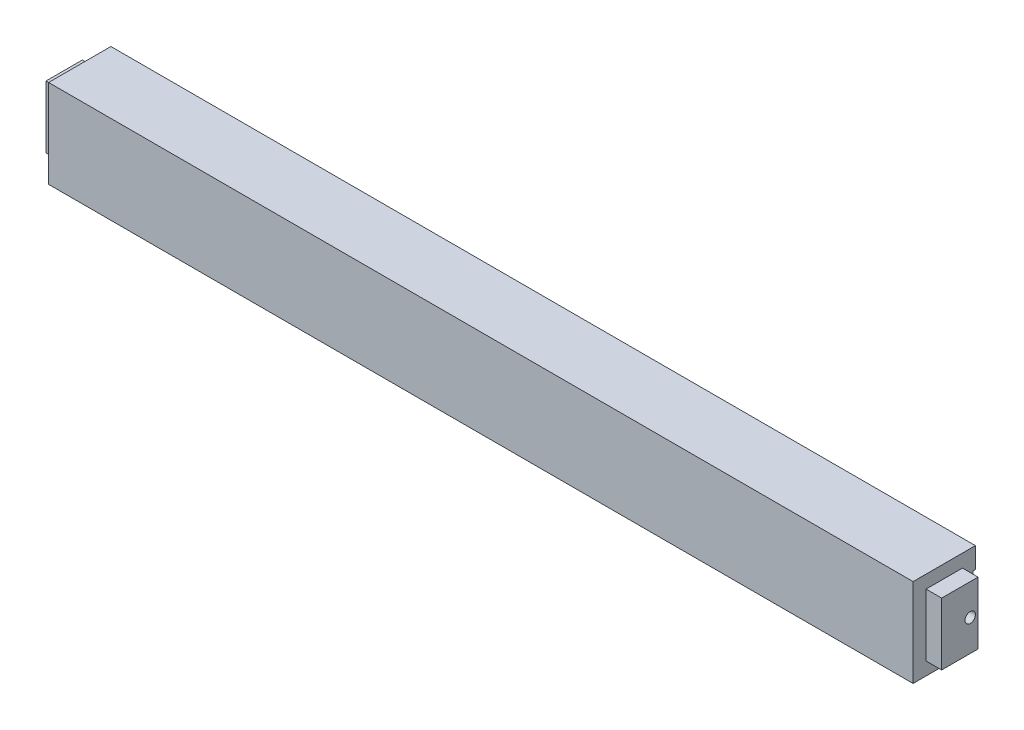
ISO-10303-21;
HEADER;
FILE_DESCRIPTION(('STEP AP214'),'2;1');
FILE_NAME('part.step','',(''),(''),'','','');
FILE_SCHEMA(('AUTOMOTIVE_DESIGN { 1 0 10303 214 1 1 1 1 }'));
ENDSEC;
DATA;
#1=APPLICATION_CONTEXT('core data for automotive mechanical design processes');
#2=APPLICATION_PROTOCOL_DEFINITION('international standard','automotive_design',2000,#1);
#3=PRODUCT_CONTEXT('',#1,'mechanical');
#4=PRODUCT('Part','Part','',(#3));
#5=PRODUCT_RELATED_PRODUCT_CATEGORY('part','',(#4));
#6=PRODUCT_DEFINITION_FORMATION('','',#4);
#7=PRODUCT_DEFINITION_CONTEXT('part definition',#1,'design');
#8=PRODUCT_DEFINITION('design','',#6,#7);
#9=PRODUCT_DEFINITION_SHAPE('','',#8);
#10=(LENGTH_UNIT() NAMED_UNIT(*) SI_UNIT(.MILLI.,.METRE.));
#11=(NAMED_UNIT(*) PLANE_ANGLE_UNIT() SI_UNIT($,.RADIAN.));
#12=(NAMED_UNIT(*) SI_UNIT($,.STERADIAN.) SOLID_ANGLE_UNIT());
#13=UNCERTAINTY_MEASURE_WITH_UNIT(LENGTH_MEASURE(1.E-05),#10,'distance_accuracy_value','');
#14=(GEOMETRIC_REPRESENTATION_CONTEXT(3) GLOBAL_UNCERTAINTY_ASSIGNED_CONTEXT((#13)) GLOBAL_UNIT_ASSIGNED_CONTEXT((#10,
#11,#12)) REPRESENTATION_CONTEXT('',''));
#15=CARTESIAN_POINT('',(0.,0.,0.));
#16=DIRECTION('',(0.,0.,1.));
#17=DIRECTION('',(1.,0.,0.));
#18=AXIS2_PLACEMENT_3D('',#15,#16,#17);
#19=CARTESIAN_POINT('',(0.,0.,0.));
#20=DIRECTION('',(0.,0.,-1.));
#21=DIRECTION('',(-1.,0.,0.));
#22=AXIS2_PLACEMENT_3D('',#19,#20,#21);
#23=PLANE('',#22);
#24=CARTESIAN_POINT('',(-461.9625,0.,0.));
#25=DIRECTION('',(0.,0.,-1.));
#26=DIRECTION('',(-1.,0.,0.));
#27=AXIS2_PLACEMENT_3D('',#24,#25,#26);
#28=CIRCLE('',#27,12.7);
#29=CARTESIAN_POINT('',(-474.6625,0.,0.));
#30=VERTEX_POINT('',#29);
#31=EDGE_CURVE('E502',#30,#30,#28,.T.);
#32=ORIENTED_EDGE('',*,*,#31,.F.);
#33=EDGE_LOOP('',(#32));
#34=FACE_BOUND('',#33,.T.);
#35=CARTESIAN_POINT('',(461.9625,0.,0.));
#36=DIRECTION('',(0.,0.,-1.));
#37=DIRECTION('',(-1.,0.,0.));
#38=AXIS2_PLACEMENT_3D('',#35,#36,#37);
#39=CIRCLE('',#38,12.7);
#40=CARTESIAN_POINT('',(449.2625,0.,0.));
#41=VERTEX_POINT('',#40);
#42=EDGE_CURVE('E505',#41,#41,#39,.T.);
#43=ORIENTED_EDGE('',*,*,#42,.F.);
#44=EDGE_LOOP('',(#43));
#45=FACE_BOUND('',#44,.T.);
#46=DIRECTION('',(1.,0.,0.));
#47=VECTOR('',#46,1.);
#48=CARTESIAN_POINT('',(-528.6375,19.05,0.));
#49=LINE('',#48,#47);
#50=CARTESIAN_POINT('',(-528.6375,19.05,0.));
#51=VERTEX_POINT('',#50);
#52=CARTESIAN_POINT('',(528.6375,19.05,0.));
#53=VERTEX_POINT('',#52);
#54=EDGE_CURVE('E210',#51,#53,#49,.T.);
#55=ORIENTED_EDGE('',*,*,#54,.T.);
#56=DIRECTION('',(0.,1.,0.));
#57=VECTOR('',#56,1.);
#58=CARTESIAN_POINT('',(528.6375,53.9750000000001,0.));
#59=LINE('',#58,#57);
#60=CARTESIAN_POINT('',(528.6375,-53.975,0.));
#61=VERTEX_POINT('',#60);
#62=EDGE_CURVE('E272',#61,#53,#59,.T.);
#63=ORIENTED_EDGE('',*,*,#62,.F.);
#64=DIRECTION('',(1.,0.,0.));
#65=VECTOR('',#64,1.);
#66=CARTESIAN_POINT('',(528.6375,-53.975,0.));
#67=LINE('',#66,#65);
#68=CARTESIAN_POINT('',(-528.6375,-53.9750000000001,0.));
#69=VERTEX_POINT('',#68);
#70=EDGE_CURVE('E269',#69,#61,#67,.T.);
#71=ORIENTED_EDGE('',*,*,#70,.F.);
#72=DIRECTION('',(0.,-1.,0.));
#73=VECTOR('',#72,1.);
#74=CARTESIAN_POINT('',(-528.6375,53.9749999999999,0.));
#75=LINE('',#74,#73);
#76=EDGE_CURVE('E254',#51,#69,#75,.T.);
#77=ORIENTED_EDGE('',*,*,#76,.F.);
#78=EDGE_LOOP('',(#55,#63,#71,#77));
#79=FACE_BOUND('',#78,.T.);
#80=ADVANCED_FACE('F33',(#34,#45,#79),#23,.T.);
#81=CARTESIAN_POINT('',(528.6375,53.9750000000001,76.2));
#82=DIRECTION('',(-1.,0.,0.));
#83=DIRECTION('',(0.,0.,1.));
#84=AXIS2_PLACEMENT_3D('',#81,#82,#83);
#85=PLANE('',#84);
#86=ORIENTED_EDGE('',*,*,#62,.T.);
#87=DIRECTION('',(0.,0.,-1.));
#88=VECTOR('',#87,1.);
#89=CARTESIAN_POINT('',(528.6375,19.05,0.));
#90=LINE('',#89,#88);
#91=CARTESIAN_POINT('',(528.6375,19.05,3.175));
#92=VERTEX_POINT('',#91);
#93=EDGE_CURVE('E197',#92,#53,#90,.T.);
#94=ORIENTED_EDGE('',*,*,#93,.F.);
#95=DIRECTION('',(0.,-1.,0.));
#96=VECTOR('',#95,1.);
#97=CARTESIAN_POINT('',(528.6375,28.575,3.175));
#98=LINE('',#97,#96);
#99=CARTESIAN_POINT('',(528.6375,28.575,3.175));
#100=VERTEX_POINT('',#99);
#101=EDGE_CURVE('E206',#100,#92,#98,.T.);
#102=ORIENTED_EDGE('',*,*,#101,.F.);
#103=DIRECTION('',(0.,0.,1.));
#104=VECTOR('',#103,1.);
#105=CARTESIAN_POINT('',(528.6375,28.575,0.));
#106=LINE('',#105,#104);
#107=CARTESIAN_POINT('',(528.6375,28.575,0.));
#108=VERTEX_POINT('',#107);
#109=EDGE_CURVE('E163',#108,#100,#106,.T.);
#110=ORIENTED_EDGE('',*,*,#109,.F.);
#111=CARTESIAN_POINT('',(528.6375,53.9750000000001,0.));
#112=VERTEX_POINT('',#111);
#113=EDGE_CURVE('E271',#108,#112,#59,.T.);
#114=ORIENTED_EDGE('',*,*,#113,.T.);
#115=DIRECTION('',(0.,0.,-1.));
#116=VECTOR('',#115,1.);
#117=CARTESIAN_POINT('',(528.6375,53.9750000000001,76.2));
#118=LINE('',#117,#116);
#119=CARTESIAN_POINT('',(528.6375,53.9750000000001,76.2));
#120=VERTEX_POINT('',#119);
#121=EDGE_CURVE('E278',#120,#112,#118,.T.);
#122=ORIENTED_EDGE('',*,*,#121,.F.);
#123=DIRECTION('',(0.,1.,0.));
#124=VECTOR('',#123,1.);
#125=CARTESIAN_POINT('',(528.6375,53.9750000000001,76.2));
#126=LINE('',#125,#124);
#127=CARTESIAN_POINT('',(528.6375,-53.975,76.2));
#128=VERTEX_POINT('',#127);
#129=EDGE_CURVE('E261',#128,#120,#126,.T.);
#130=ORIENTED_EDGE('',*,*,#129,.F.);
#131=DIRECTION('',(0.,0.,-1.));
#132=VECTOR('',#131,1.);
#133=CARTESIAN_POINT('',(528.6375,-53.975,76.2));
#134=LINE('',#133,#132);
#135=EDGE_CURVE('E46',#128,#61,#134,.T.);
#136=ORIENTED_EDGE('',*,*,#135,.T.);
#137=EDGE_LOOP('',(#86,#94,#102,#110,#114,#122,#130,#136));
#138=FACE_BOUND('',#137,.T.);
#139=DIRECTION('',(0.,1.,0.));
#140=VECTOR('',#139,1.);
#141=CARTESIAN_POINT('',(528.6375,38.1000000000001,15.875));
#142=LINE('',#141,#140);
#143=CARTESIAN_POINT('',(528.6375,-38.1,15.875));
#144=VERTEX_POINT('',#143);
#145=CARTESIAN_POINT('',(528.6375,38.1000000000001,15.875));
#146=VERTEX_POINT('',#145);
#147=EDGE_CURVE('E221',#144,#146,#142,.T.);
#148=ORIENTED_EDGE('',*,*,#147,.F.);
#149=DIRECTION('',(0.,0.,-1.));
#150=VECTOR('',#149,1.);
#151=CARTESIAN_POINT('',(528.6375,-38.1,60.325));
#152=LINE('',#151,#150);
#153=CARTESIAN_POINT('',(528.6375,-38.1,60.325));
#154=VERTEX_POINT('',#153);
#155=EDGE_CURVE('E226',#154,#144,#152,.T.);
#156=ORIENTED_EDGE('',*,*,#155,.F.);
#157=DIRECTION('',(0.,-1.,0.));
#158=VECTOR('',#157,1.);
#159=CARTESIAN_POINT('',(528.6375,38.1000000000001,60.325));
#160=LINE('',#159,#158);
#161=CARTESIAN_POINT('',(528.6375,38.1000000000001,60.325));
#162=VERTEX_POINT('',#161);
#163=EDGE_CURVE('E238',#162,#154,#160,.T.);
#164=ORIENTED_EDGE('',*,*,#163,.F.);
#165=DIRECTION('',(0.,0.,1.));
#166=VECTOR('',#165,1.);
#167=CARTESIAN_POINT('',(528.6375,38.1000000000001,60.325));
#168=LINE('',#167,#166);
#169=EDGE_CURVE('E235',#146,#162,#168,.T.);
#170=ORIENTED_EDGE('',*,*,#169,.F.);
#171=EDGE_LOOP('',(#148,#156,#164,#170));
#172=FACE_BOUND('',#171,.T.);
#173=ADVANCED_FACE('F330',(#138,#172),#85,.F.);
#174=CARTESIAN_POINT('',(-528.6375,53.9749999999999,76.2));
#175=DIRECTION('',(1.,0.,0.));
#176=DIRECTION('',(0.,0.,-1.));
#177=AXIS2_PLACEMENT_3D('',#174,#175,#176);
#178=PLANE('',#177);
#179=DIRECTION('',(0.,0.,-1.));
#180=VECTOR('',#179,1.);
#181=CARTESIAN_POINT('',(-528.6375,-38.1,60.325));
#182=LINE('',#181,#180);
#183=CARTESIAN_POINT('',(-528.6375,-38.1,60.325));
#184=VERTEX_POINT('',#183);
#185=CARTESIAN_POINT('',(-528.6375,-38.1,15.875));
#186=VERTEX_POINT('',#185);
#187=EDGE_CURVE('E185',#184,#186,#182,.T.);
#188=ORIENTED_EDGE('',*,*,#187,.T.);
#189=DIRECTION('',(0.,1.,0.));
#190=VECTOR('',#189,1.);
#191=CARTESIAN_POINT('',(-528.6375,38.1000000000001,15.875));
#192=LINE('',#191,#190);
#193=CARTESIAN_POINT('',(-528.6375,38.1000000000001,15.875));
#194=VERTEX_POINT('',#193);
#195=EDGE_CURVE('E158',#186,#194,#192,.T.);
#196=ORIENTED_EDGE('',*,*,#195,.T.);
#197=DIRECTION('',(0.,0.,1.));
#198=VECTOR('',#197,1.);
#199=CARTESIAN_POINT('',(-528.6375,38.1000000000001,60.325));
#200=LINE('',#199,#198);
#201=CARTESIAN_POINT('',(-528.6375,38.1000000000001,60.325));
#202=VERTEX_POINT('',#201);
#203=EDGE_CURVE('E174',#194,#202,#200,.T.);
#204=ORIENTED_EDGE('',*,*,#203,.T.);
#205=DIRECTION('',(0.,-1.,0.));
#206=VECTOR('',#205,1.);
#207=CARTESIAN_POINT('',(-528.6375,38.1000000000001,60.325));
#208=LINE('',#207,#206);
#209=EDGE_CURVE('E54',#202,#184,#208,.T.);
#210=ORIENTED_EDGE('',*,*,#209,.T.);
#211=EDGE_LOOP('',(#188,#196,#204,#210));
#212=FACE_BOUND('',#211,.T.);
#213=DIRECTION('',(0.,-1.,0.));
#214=VECTOR('',#213,1.);
#215=CARTESIAN_POINT('',(-528.6375,28.575,3.175));
#216=LINE('',#215,#214);
#217=CARTESIAN_POINT('',(-528.6375,28.575,3.175));
#218=VERTEX_POINT('',#217);
#219=CARTESIAN_POINT('',(-528.6375,19.05,3.175));
#220=VERTEX_POINT('',#219);
#221=EDGE_CURVE('E196',#218,#220,#216,.T.);
#222=ORIENTED_EDGE('',*,*,#221,.T.);
#223=DIRECTION('',(0.,0.,-1.));
#224=VECTOR('',#223,1.);
#225=CARTESIAN_POINT('',(-528.6375,19.05,0.));
#226=LINE('',#225,#224);
#227=EDGE_CURVE('E200',#220,#51,#226,.T.);
#228=ORIENTED_EDGE('',*,*,#227,.T.);
#229=ORIENTED_EDGE('',*,*,#76,.T.);
#230=DIRECTION('',(0.,0.,-1.));
#231=VECTOR('',#230,1.);
#232=CARTESIAN_POINT('',(-528.6375,-53.9750000000001,76.2));
#233=LINE('',#232,#231);
#234=CARTESIAN_POINT('',(-528.6375,-53.9750000000001,76.2));
#235=VERTEX_POINT('',#234);
#236=EDGE_CURVE('E11',#235,#69,#233,.T.);
#237=ORIENTED_EDGE('',*,*,#236,.F.);
#238=DIRECTION('',(0.,-1.,0.));
#239=VECTOR('',#238,1.);
#240=CARTESIAN_POINT('',(-528.6375,53.9749999999999,76.2));
#241=LINE('',#240,#239);
#242=CARTESIAN_POINT('',(-528.6375,53.9749999999999,76.2));
#243=VERTEX_POINT('',#242);
#244=EDGE_CURVE('E255',#243,#235,#241,.T.);
#245=ORIENTED_EDGE('',*,*,#244,.F.);
#246=DIRECTION('',(0.,0.,-1.));
#247=VECTOR('',#246,1.);
#248=CARTESIAN_POINT('',(-528.6375,53.9749999999999,76.2));
#249=LINE('',#248,#247);
#250=CARTESIAN_POINT('',(-528.6375,53.9749999999999,0.));
#251=VERTEX_POINT('',#250);
#252=EDGE_CURVE('E265',#243,#251,#249,.T.);
#253=ORIENTED_EDGE('',*,*,#252,.T.);
#254=CARTESIAN_POINT('',(-528.6375,28.575,0.));
#255=VERTEX_POINT('',#254);
#256=EDGE_CURVE('E266',#251,#255,#75,.T.);
#257=ORIENTED_EDGE('',*,*,#256,.T.);
#258=DIRECTION('',(0.,0.,1.));
#259=VECTOR('',#258,1.);
#260=CARTESIAN_POINT('',(-528.6375,28.575,0.));
#261=LINE('',#260,#259);
#262=EDGE_CURVE('E62',#255,#218,#261,.T.);
#263=ORIENTED_EDGE('',*,*,#262,.T.);
#264=EDGE_LOOP('',(#222,#228,#229,#237,#245,#253,#257,#263));
#265=FACE_BOUND('',#264,.T.);
#266=ADVANCED_FACE('F35',(#212,#265),#178,.F.);
#267=CARTESIAN_POINT('',(528.6375,-53.975,76.2));
#268=DIRECTION('',(0.,1.,0.));
#269=DIRECTION('',(-1.,0.,0.));
#270=AXIS2_PLACEMENT_3D('',#267,#268,#269);
#271=PLANE('',#270);
#272=ORIENTED_EDGE('',*,*,#70,.T.);
#273=ORIENTED_EDGE('',*,*,#135,.F.);
#274=DIRECTION('',(1.,0.,0.));
#275=VECTOR('',#274,1.);
#276=CARTESIAN_POINT('',(528.6375,-53.975,76.2));
#277=LINE('',#276,#275);
#278=EDGE_CURVE('E258',#235,#128,#277,.T.);
#279=ORIENTED_EDGE('',*,*,#278,.F.);
#280=ORIENTED_EDGE('',*,*,#236,.T.);
#281=EDGE_LOOP('',(#272,#273,#279,#280));
#282=FACE_BOUND('',#281,.T.);
#283=ADVANCED_FACE('F379',(#282),#271,.F.);
#284=CARTESIAN_POINT('',(528.6375,53.9750000000001,76.2));
#285=DIRECTION('',(0.,-1.,0.));
#286=DIRECTION('',(1.,0.,0.));
#287=AXIS2_PLACEMENT_3D('',#284,#285,#286);
#288=PLANE('',#287);
#289=DIRECTION('',(-1.,0.,0.));
#290=VECTOR('',#289,1.);
#291=CARTESIAN_POINT('',(528.6375,53.9750000000001,0.));
#292=LINE('',#291,#290);
#293=EDGE_CURVE('E259',#112,#251,#292,.T.);
#294=ORIENTED_EDGE('',*,*,#293,.T.);
#295=ORIENTED_EDGE('',*,*,#252,.F.);
#296=DIRECTION('',(-1.,0.,0.));
#297=VECTOR('',#296,1.);
#298=CARTESIAN_POINT('',(528.6375,53.9750000000001,76.2));
#299=LINE('',#298,#297);
#300=EDGE_CURVE('E263',#120,#243,#299,.T.);
#301=ORIENTED_EDGE('',*,*,#300,.F.);
#302=ORIENTED_EDGE('',*,*,#121,.T.);
#303=EDGE_LOOP('',(#294,#295,#301,#302));
#304=FACE_BOUND('',#303,.T.);
#305=ADVANCED_FACE('F354',(#304),#288,.F.);
#306=CARTESIAN_POINT('',(0.,0.,76.2));
#307=DIRECTION('',(0.,0.,-1.));
#308=DIRECTION('',(-1.,0.,0.));
#309=AXIS2_PLACEMENT_3D('',#306,#307,#308);
#310=PLANE('',#309);
#311=ORIENTED_EDGE('',*,*,#244,.T.);
#312=ORIENTED_EDGE('',*,*,#278,.T.);
#313=ORIENTED_EDGE('',*,*,#129,.T.);
#314=ORIENTED_EDGE('',*,*,#300,.T.);
#315=EDGE_LOOP('',(#311,#312,#313,#314));
#316=FACE_BOUND('',#315,.T.);
#317=ADVANCED_FACE('F345',(#316),#310,.F.);
#318=DIRECTION('',(1.,0.,0.));
#319=VECTOR('',#318,1.);
#320=CARTESIAN_POINT('',(-528.6375,28.575,0.));
#321=LINE('',#320,#319);
#322=EDGE_CURVE('E203',#255,#108,#321,.T.);
#323=ORIENTED_EDGE('',*,*,#322,.F.);
#324=ORIENTED_EDGE('',*,*,#256,.F.);
#325=ORIENTED_EDGE('',*,*,#293,.F.);
#326=ORIENTED_EDGE('',*,*,#113,.F.);
#327=EDGE_LOOP('',(#323,#324,#325,#326));
#328=FACE_BOUND('',#327,.T.);
#329=ADVANCED_FACE('F333',(#328),#23,.T.);
#330=CARTESIAN_POINT('',(547.6875,38.1000000000001,15.875));
#331=DIRECTION('',(0.,0.,1.));
#332=DIRECTION('',(0.,-1.,0.));
#333=AXIS2_PLACEMENT_3D('',#330,#331,#332);
#334=PLANE('',#333);
#335=ORIENTED_EDGE('',*,*,#147,.T.);
#336=DIRECTION('',(-1.,0.,0.));
#337=VECTOR('',#336,1.);
#338=CARTESIAN_POINT('',(547.6875,38.1000000000001,15.875));
#339=LINE('',#338,#337);
#340=CARTESIAN_POINT('',(547.6875,38.1000000000001,15.875));
#341=VERTEX_POINT('',#340);
#342=EDGE_CURVE('E251',#341,#146,#339,.T.);
#343=ORIENTED_EDGE('',*,*,#342,.F.);
#344=DIRECTION('',(0.,1.,0.));
#345=VECTOR('',#344,1.);
#346=CARTESIAN_POINT('',(547.6875,38.1000000000001,15.875));
#347=LINE('',#346,#345);
#348=CARTESIAN_POINT('',(547.6875,-38.1,15.875));
#349=VERTEX_POINT('',#348);
#350=EDGE_CURVE('E222',#349,#341,#347,.T.);
#351=ORIENTED_EDGE('',*,*,#350,.F.);
#352=DIRECTION('',(-1.,0.,0.));
#353=VECTOR('',#352,1.);
#354=CARTESIAN_POINT('',(547.6875,-38.1,15.875));
#355=LINE('',#354,#353);
#356=EDGE_CURVE('E232',#349,#144,#355,.T.);
#357=ORIENTED_EDGE('',*,*,#356,.T.);
#358=EDGE_LOOP('',(#335,#343,#351,#357));
#359=FACE_BOUND('',#358,.T.);
#360=ADVANCED_FACE('F344',(#359),#334,.F.);
#361=CARTESIAN_POINT('',(547.6875,38.1000000000001,60.325));
#362=DIRECTION('',(0.,-1.,0.));
#363=DIRECTION('',(0.,0.,-1.));
#364=AXIS2_PLACEMENT_3D('',#361,#362,#363);
#365=PLANE('',#364);
#366=ORIENTED_EDGE('',*,*,#169,.T.);
#367=DIRECTION('',(-1.,0.,0.));
#368=VECTOR('',#367,1.);
#369=CARTESIAN_POINT('',(547.6875,38.1000000000001,60.325));
#370=LINE('',#369,#368);
#371=CARTESIAN_POINT('',(547.6875,38.1000000000001,60.325));
#372=VERTEX_POINT('',#371);
#373=EDGE_CURVE('E248',#372,#162,#370,.T.);
#374=ORIENTED_EDGE('',*,*,#373,.F.);
#375=DIRECTION('',(0.,0.,1.));
#376=VECTOR('',#375,1.);
#377=CARTESIAN_POINT('',(547.6875,38.1000000000001,60.325));
#378=LINE('',#377,#376);
#379=EDGE_CURVE('E225',#341,#372,#378,.T.);
#380=ORIENTED_EDGE('',*,*,#379,.F.);
#381=ORIENTED_EDGE('',*,*,#342,.T.);
#382=EDGE_LOOP('',(#366,#374,#380,#381));
#383=FACE_BOUND('',#382,.T.);
#384=ADVANCED_FACE('F351',(#383),#365,.F.);
#385=CARTESIAN_POINT('',(547.6875,38.1000000000001,60.325));
#386=DIRECTION('',(0.,0.,-1.));
#387=DIRECTION('',(0.,1.,0.));
#388=AXIS2_PLACEMENT_3D('',#385,#386,#387);
#389=PLANE('',#388);
#390=ORIENTED_EDGE('',*,*,#163,.T.);
#391=DIRECTION('',(-1.,0.,0.));
#392=VECTOR('',#391,1.);
#393=CARTESIAN_POINT('',(547.6875,-38.1,60.325));
#394=LINE('',#393,#392);
#395=CARTESIAN_POINT('',(547.6875,-38.1,60.325));
#396=VERTEX_POINT('',#395);
#397=EDGE_CURVE('E245',#396,#154,#394,.T.);
#398=ORIENTED_EDGE('',*,*,#397,.F.);
#399=DIRECTION('',(0.,-1.,0.));
#400=VECTOR('',#399,1.);
#401=CARTESIAN_POINT('',(547.6875,38.1000000000001,60.325));
#402=LINE('',#401,#400);
#403=EDGE_CURVE('E228',#372,#396,#402,.T.);
#404=ORIENTED_EDGE('',*,*,#403,.F.);
#405=ORIENTED_EDGE('',*,*,#373,.T.);
#406=EDGE_LOOP('',(#390,#398,#404,#405));
#407=FACE_BOUND('',#406,.T.);
#408=ADVANCED_FACE('F535',(#407),#389,.F.);
#409=CARTESIAN_POINT('',(547.6875,-38.1,60.325));
#410=DIRECTION('',(0.,1.,0.));
#411=DIRECTION('',(0.,0.,1.));
#412=AXIS2_PLACEMENT_3D('',#409,#410,#411);
#413=PLANE('',#412);
#414=ORIENTED_EDGE('',*,*,#155,.T.);
#415=ORIENTED_EDGE('',*,*,#356,.F.);
#416=DIRECTION('',(0.,0.,-1.));
#417=VECTOR('',#416,1.);
#418=CARTESIAN_POINT('',(547.6875,-38.1,60.325));
#419=LINE('',#418,#417);
#420=EDGE_CURVE('E230',#396,#349,#419,.T.);
#421=ORIENTED_EDGE('',*,*,#420,.F.);
#422=ORIENTED_EDGE('',*,*,#397,.T.);
#423=EDGE_LOOP('',(#414,#415,#421,#422));
#424=FACE_BOUND('',#423,.T.);
#425=ADVANCED_FACE('F525',(#424),#413,.F.);
#426=CARTESIAN_POINT('',(547.6875,0.,0.));
#427=DIRECTION('',(1.,0.,0.));
#428=DIRECTION('',(0.,0.,-1.));
#429=AXIS2_PLACEMENT_3D('',#426,#427,#428);
#430=PLANE('',#429);
#431=CARTESIAN_POINT('',(547.6875,0.,25.4));
#432=DIRECTION('',(1.,0.,0.));
#433=DIRECTION('',(0.,0.,-1.));
#434=AXIS2_PLACEMENT_3D('',#431,#432,#433);
#435=CIRCLE('',#434,6.35);
#436=CARTESIAN_POINT('',(547.6875,0.,19.05));
#437=VERTEX_POINT('',#436);
#438=EDGE_CURVE('E213',#437,#437,#435,.T.);
#439=ORIENTED_EDGE('',*,*,#438,.F.);
#440=EDGE_LOOP('',(#439));
#441=FACE_BOUND('',#440,.T.);
#442=ORIENTED_EDGE('',*,*,#350,.T.);
#443=ORIENTED_EDGE('',*,*,#379,.T.);
#444=ORIENTED_EDGE('',*,*,#403,.T.);
#445=ORIENTED_EDGE('',*,*,#420,.T.);
#446=EDGE_LOOP('',(#442,#443,#444,#445));
#447=FACE_BOUND('',#446,.T.);
#448=ADVANCED_FACE('F401',(#441,#447),#430,.T.);
#449=CARTESIAN_POINT('',(461.9625,0.,25.4));
#450=DIRECTION('',(1.,0.,0.));
#451=DIRECTION('',(0.,0.,-1.));
#452=AXIS2_PLACEMENT_3D('',#449,#450,#451);
#453=CYLINDRICAL_SURFACE('',#452,6.35);
#454=CARTESIAN_POINT('',(474.6625,0.,19.05));
#455=CARTESIAN_POINT('',(474.662499489178,-0.166990879194913,19.0500005578241));
#456=CARTESIAN_POINT('',(474.659198672826,-0.33399345019863,19.0565948288007));
#457=CARTESIAN_POINT('',(474.646078620322,-0.666768526640044,19.0828966713318));
#458=CARTESIAN_POINT('',(474.636256548452,-0.83254046522313,19.1026099475924));
#459=CARTESIAN_POINT('',(474.610329247809,-1.16177467728403,19.1549537986889));
#460=CARTESIAN_POINT('',(474.594215058958,-1.32523331106835,19.1876027951803));
#461=CARTESIAN_POINT('',(474.556108506232,-1.64849348247789,19.2654563299769));
#462=CARTESIAN_POINT('',(474.53411373985,-1.80829349634147,19.3106660002377));
#463=CARTESIAN_POINT('',(474.484895914272,-2.12244180878878,19.4129388196706));
#464=CARTESIAN_POINT('',(474.457695965081,-2.27681076158406,19.4699496620562));
#465=CARTESIAN_POINT('',(474.398650269919,-2.57993454237572,19.5953997219411));
#466=CARTESIAN_POINT('',(474.366802784377,-2.72868724185101,19.6638432200766));
#467=CARTESIAN_POINT('',(474.265381193969,-3.16512812193647,19.8854083264862));
#468=CARTESIAN_POINT('',(474.189871335403,-3.44334503957524,20.0548783589608));
#469=CARTESIAN_POINT('',(474.024718677386,-3.98471796121714,20.4439425060138));
#470=CARTESIAN_POINT('',(473.934497231219,-4.24594454614362,20.6659487582065));
#471=CARTESIAN_POINT('',(473.751896014884,-4.72936553155196,21.1488518088036));
#472=CARTESIAN_POINT('',(473.659514660148,-4.95153018780439,21.4097779662557));
#473=CARTESIAN_POINT('',(473.522824339822,-5.2595539877823,21.8371751332907));
#474=CARTESIAN_POINT('',(473.475972148548,-5.36106270491311,21.9917961062386));
#475=CARTESIAN_POINT('',(473.385809949723,-5.55058368760465,22.3100523845248));
#476=CARTESIAN_POINT('',(473.342498468069,-5.6386015832921,22.4736838905297));
#477=CARTESIAN_POINT('',(473.260909805789,-5.80035808289101,22.8090521355947));
#478=CARTESIAN_POINT('',(473.222632294573,-5.87409762464254,22.9807883413946));
#479=CARTESIAN_POINT('',(473.152588210094,-6.0064578883652,23.3311830567998));
#480=CARTESIAN_POINT('',(473.120817791759,-6.06508754416238,23.5098374037922));
#481=CARTESIAN_POINT('',(473.066759497995,-6.16347180761614,23.8619762089704));
#482=CARTESIAN_POINT('',(473.04401961136,-6.20414249112448,24.0351350174891));
#483=CARTESIAN_POINT('',(473.00638048444,-6.27089941680449,24.3850899099045));
#484=CARTESIAN_POINT('',(472.99148090876,-6.29698628284914,24.5618858378754));
#485=CARTESIAN_POINT('',(472.970176308681,-6.33415533919378,24.9174092947642));
#486=CARTESIAN_POINT('',(472.963764099381,-6.34525022098377,25.0961350605956));
#487=CARTESIAN_POINT('',(472.959700488672,-6.3522911075755,25.4539765423064));
#488=CARTESIAN_POINT('',(472.962048251405,-6.34823855771195,25.6330922193515));
#489=CARTESIAN_POINT('',(472.974590292946,-6.32645177136463,25.9685823018751));
#490=CARTESIAN_POINT('',(472.983809583329,-6.31041699475489,26.1251073598702));
#491=CARTESIAN_POINT('',(473.008628374712,-6.26687134491481,26.4360905346578));
#492=CARTESIAN_POINT('',(473.024229978982,-6.23935668847138,26.5905479527216));
#493=CARTESIAN_POINT('',(473.061302790456,-6.1731687344852,26.896311296702));
#494=CARTESIAN_POINT('',(473.082773227066,-6.13449690187388,27.0476176335595));
#495=CARTESIAN_POINT('',(473.130919038309,-6.04639785576763,27.3462386420033));
#496=CARTESIAN_POINT('',(473.15759645801,-5.99696641549928,27.4935517192419));
#497=CARTESIAN_POINT('',(473.245637611808,-5.83067999912414,27.9349287269347));
#498=CARTESIAN_POINT('',(473.314125656313,-5.69733157989736,28.2215505621939));
#499=CARTESIAN_POINT('',(473.462571400071,-5.39139880582655,28.7695768501172));
#500=CARTESIAN_POINT('',(473.542534245228,-5.21879682720651,29.03096990043));
#501=CARTESIAN_POINT('',(473.717181288204,-4.81373716307425,29.5561874309588));
#502=CARTESIAN_POINT('',(473.812446508613,-4.57646495884524,29.8161176703508));
#503=CARTESIAN_POINT('',(473.998785476425,-4.06112275052912,30.2942034008618));
#504=CARTESIAN_POINT('',(474.089857204944,-3.78303336001458,30.5123389271411));
#505=CARTESIAN_POINT('',(474.218438857257,-3.332866437397,30.8082213745172));
#506=CARTESIAN_POINT('',(474.26080502543,-3.17335722609793,30.9033598467224));
#507=CARTESIAN_POINT('',(474.340721830176,-2.8456977162644,31.0797067112437));
#508=CARTESIAN_POINT('',(474.378274629749,-2.67755134695864,31.1609213661293));
#509=CARTESIAN_POINT('',(474.447457929256,-2.33378760343933,31.3085465711069));
#510=CARTESIAN_POINT('',(474.479090729346,-2.1581731635514,31.3749628728655));
#511=CARTESIAN_POINT('',(474.535487636006,-1.80074808519268,31.4922216599825));
#512=CARTESIAN_POINT('',(474.560252532703,-1.61893816219403,31.5430659369152));
#513=CARTESIAN_POINT('',(474.600391559762,-1.2659363548543,31.6249469597454));
#514=CARTESIAN_POINT('',(474.616373645966,-1.09511243698787,31.6572755863087));
#515=CARTESIAN_POINT('',(474.641456242038,-0.750891318848446,31.7078455883632));
#516=CARTESIAN_POINT('',(474.650557126214,-0.577494259066558,31.7260877300998));
#517=CARTESIAN_POINT('',(474.661615837058,-0.229629611373423,31.7482387238993));
#518=CARTESIAN_POINT('',(474.663576519709,-0.0551624794535666,31.7521533067929));
#519=CARTESIAN_POINT('',(474.660305903488,0.293430507417571,31.7456113920506));
#520=CARTESIAN_POINT('',(474.655074922904,0.467556377130838,31.7351555304199));
#521=CARTESIAN_POINT('',(474.638255509451,0.800509536744074,31.7013863684794));
#522=CARTESIAN_POINT('',(474.627193478102,0.959472887164149,31.6791369259981));
#523=CARTESIAN_POINT('',(474.599345956445,1.2748284005213,31.6227788375183));
#524=CARTESIAN_POINT('',(474.582558523108,1.43121967165999,31.5886661654175));
#525=CARTESIAN_POINT('',(474.543659973299,1.74030776864039,31.5089520470411));
#526=CARTESIAN_POINT('',(474.521550563081,1.89300576133385,31.4633542827278));
#527=CARTESIAN_POINT('',(474.472497179298,2.19390570072534,31.3610856089416));
#528=CARTESIAN_POINT('',(474.44555132453,2.34210587161403,31.3044103899676));
#529=CARTESIAN_POINT('',(474.386595177989,2.63725856238889,31.1787377060281));
#530=CARTESIAN_POINT('',(474.354463563851,2.78405822350621,31.1094379949031));
#531=CARTESIAN_POINT('',(474.28642525103,3.07126756713195,30.9602186059223));
#532=CARTESIAN_POINT('',(474.25051727352,3.21167506178121,30.8802953280643));
#533=CARTESIAN_POINT('',(474.138274129222,3.62227376445687,30.6254508863186));
#534=CARTESIAN_POINT('',(474.057387708283,3.88199540128408,30.435388921212));
#535=CARTESIAN_POINT('',(473.881949948304,4.39279994151144,29.9988601558327));
#536=CARTESIAN_POINT('',(473.786836723692,4.64052990372699,29.7486871948669));
#537=CARTESIAN_POINT('',(473.646477281117,4.97892395439648,29.3450899101486));
#538=CARTESIAN_POINT('',(473.600043256276,5.08625380253174,29.2057238948598));
#539=CARTESIAN_POINT('',(473.509173404949,5.28929908879007,28.918066257321));
#540=CARTESIAN_POINT('',(473.464737878047,5.38501278922793,28.7697733046221));
#541=CARTESIAN_POINT('',(473.377083803972,5.56849389071524,28.457571899389));
#542=CARTESIAN_POINT('',(473.334030491655,5.65564549590476,28.2932545559492));
#543=CARTESIAN_POINT('',(473.253079644901,5.81556909376681,27.9566294661001));
#544=CARTESIAN_POINT('',(473.215179627994,5.88834801781484,27.784325621011));
#545=CARTESIAN_POINT('',(473.145997992612,6.01870593214495,27.4329208358407));
#546=CARTESIAN_POINT('',(473.114711065454,6.07629712370974,27.2538254849407));
#547=CARTESIAN_POINT('',(473.060049579661,6.17556605056229,26.8901016619798));
#548=CARTESIAN_POINT('',(473.036673795983,6.21724624980146,26.7054740514158));
#549=CARTESIAN_POINT('',(473.000721566146,6.28083303239844,26.3502617414747));
#550=CARTESIAN_POINT('',(472.987323858997,6.30425367574493,26.1800303008151));
#551=CARTESIAN_POINT('',(472.968406861867,6.33722186745437,25.8377940263087));
#552=CARTESIAN_POINT('',(472.962887036091,6.34677035930015,25.6657893138683));
#553=CARTESIAN_POINT('',(472.959956108837,6.3518475564986,25.321568716566));
#554=CARTESIAN_POINT('',(472.962542008161,6.34738144738997,25.1493529333738));
#555=CARTESIAN_POINT('',(472.97570735949,6.32451076696088,24.8061663339537));
#556=CARTESIAN_POINT('',(472.986286484255,6.30610676625141,24.6351954670487));
#557=CARTESIAN_POINT('',(473.013631271271,6.25804920718463,24.3121703101041));
#558=CARTESIAN_POINT('',(473.029708502891,6.22963986719982,24.1598706819789));
#559=CARTESIAN_POINT('',(473.067526837362,6.16196939123337,23.8583996393324));
#560=CARTESIAN_POINT('',(473.0892698206,6.12270465222519,23.7092292811674));
#561=CARTESIAN_POINT('',(473.162048594063,5.98919755549728,23.2677756684123));
#562=CARTESIAN_POINT('',(473.220653110889,5.87921095671373,22.9813429809077));
#563=CARTESIAN_POINT('',(473.35621559449,5.61221709335548,22.4114839944682));
#564=CARTESIAN_POINT('',(473.434142111352,5.45254719309571,22.1295526025477));
#565=CARTESIAN_POINT('',(473.597939817654,5.0936732095078,21.5946269266293));
#566=CARTESIAN_POINT('',(473.683815127909,4.89444855823949,21.3416478057666));
#567=CARTESIAN_POINT('',(473.866369911072,4.43354035272873,20.8397617448618));
#568=CARTESIAN_POINT('',(473.96309430763,4.16720894914422,20.5950845672653));
#569=CARTESIAN_POINT('',(474.10083108109,3.7381363431836,20.2636939500259));
#570=CARTESIAN_POINT('',(474.145552921756,3.59004569732542,20.1590949080461));
#571=CARTESIAN_POINT('',(474.231387247813,3.2847358988486,19.9625448224004));
#572=CARTESIAN_POINT('',(474.272501373824,3.12752095014408,19.8705880187403));
#573=CARTESIAN_POINT('',(474.35030554059,2.80361177397838,19.6994668914853));
#574=CARTESIAN_POINT('',(474.386959199977,2.63685404738458,19.6204061800404));
#575=CARTESIAN_POINT('',(474.454411529099,2.29614399762543,19.4767937145816));
#576=CARTESIAN_POINT('',(474.485213074072,2.12219525894014,19.4122348327236));
#577=CARTESIAN_POINT('',(474.540000810156,1.76872534139743,19.2984832596597));
#578=CARTESIAN_POINT('',(474.564001855399,1.58921727277207,19.2492570539977));
#579=CARTESIAN_POINT('',(474.604519952057,1.22585054083137,19.1666647309663));
#580=CARTESIAN_POINT('',(474.621041574801,1.04199460738349,19.1332889254188));
#581=CARTESIAN_POINT('',(474.643150071822,0.715063028653916,19.0887674380757));
#582=CARTESIAN_POINT('',(474.650393603708,0.572548812651072,19.074242098152));
#583=CARTESIAN_POINT('',(474.660068853457,0.286692618188969,19.0548580062807));
#584=CARTESIAN_POINT('',(474.662500438508,0.143350616991769,19.0499995211449));
#585=CARTESIAN_POINT('',(474.6625,0.,19.05));
#586=B_SPLINE_CURVE_WITH_KNOTS('',3,(#454,#455,#456,#457,#458,#459,#460,#461,#462,#463,#464,
#465,#466,#467,#468,#469,#470,#471,#472,#473,#474,#475,#476,#477,#478,#479,#480,#481,#482,#483,
#484,#485,#486,#487,#488,#489,#490,#491,#492,#493,#494,#495,#496,#497,#498,#499,#500,#501,#502,
#503,#504,#505,#506,#507,#508,#509,#510,#511,#512,#513,#514,#515,#516,#517,#518,#519,#520,#521,
#522,#523,#524,#525,#526,#527,#528,#529,#530,#531,#532,#533,#534,#535,#536,#537,#538,#539,#540,
#541,#542,#543,#544,#545,#546,#547,#548,#549,#550,#551,#552,#553,#554,#555,#556,#557,#558,#559,
#560,#561,#562,#563,#564,#565,#566,#567,#568,#569,#570,#571,#572,#573,#574,#575,#576,#577,#578,
#579,#580,#581,#582,#583,#584,#585),.UNSPECIFIED.,.T.,.F.,(4,2,2,2,2,2,2,2,2,2,2,2,2,2,2,2,2,2,
2,2,2,2,2,2,2,2,2,2,2,2,2,2,2,2,2,2,2,2,2,2,2,2,2,2,2,2,2,2,2,2,2,2,2,2,2,2,2,2,2,2,2,2,2,2,2,
4),(0.,0.50083122420536,1.00188037372803,1.50364564290689,2.00561622220709,2.50540779268628,
3.00538691725071,4.00425210956755,5.06354639773448,6.12364383897773,6.69546056113473,
7.26703799333408,7.83857787007116,8.4097790405316,8.94696617231636,9.48413032231427,
10.020839449589,10.5574973665628,11.0297819407841,11.5022222802449,11.9746006167424,
12.447164856978,13.4133450583963,14.3799599077215,15.4691385823987,16.5588362547139,
17.1296896955319,17.7002857039293,18.2706595507726,18.8409677509571,19.3640345307036,
19.8870728558157,20.4099019497636,20.9327079051584,21.4148301207384,21.8971161172382,
22.3792476958438,22.8615672144633,23.3574791185916,23.8535595025871,24.8452132673351,
25.9342484207189,26.4795520760265,27.0249372042286,27.5969396508645,28.1686655660688,
28.7399307681394,29.3111074690516,29.8274552059119,30.3437678229116,30.8598894217494,
31.3759898919437,31.8427315926275,32.3096283963947,33.2427989036526,34.2386648311406,
35.2350499582129,36.3525027406484,36.9121724680045,37.4715863502977,38.0352942497766,
38.5987244700203,39.1609143479984,39.7227601571806,40.1526787482413,40.5826092051903),.UNSPECIFIED.);
#587=CARTESIAN_POINT('',(474.6625,0.,19.05));
#588=VERTEX_POINT('',#587);
#589=EDGE_CURVE('E282',#588,#588,#586,.T.);
#590=ORIENTED_EDGE('',*,*,#589,.T.);
#591=EDGE_LOOP('',(#590));
#592=FACE_BOUND('',#591,.T.);
#593=ORIENTED_EDGE('',*,*,#438,.T.);
#594=EDGE_LOOP('',(#593));
#595=FACE_BOUND('',#594,.T.);
#596=ADVANCED_FACE('F289',(#592,#595),#453,.F.);
#597=CARTESIAN_POINT('',(-528.6375,19.05,0.));
#598=DIRECTION('',(0.,-1.,0.));
#599=DIRECTION('',(0.,0.,-1.));
#600=AXIS2_PLACEMENT_3D('',#597,#598,#599);
#601=PLANE('',#600);
#602=ORIENTED_EDGE('',*,*,#93,.T.);
#603=ORIENTED_EDGE('',*,*,#54,.F.);
#604=ORIENTED_EDGE('',*,*,#227,.F.);
#605=DIRECTION('',(1.,0.,0.));
#606=VECTOR('',#605,1.);
#607=CARTESIAN_POINT('',(-528.6375,19.05,3.175));
#608=LINE('',#607,#606);
#609=EDGE_CURVE('E214',#220,#92,#608,.T.);
#610=ORIENTED_EDGE('',*,*,#609,.T.);
#611=EDGE_LOOP('',(#602,#603,#604,#610));
#612=FACE_BOUND('',#611,.T.);
#613=ADVANCED_FACE('F319',(#612),#601,.F.);
#614=CARTESIAN_POINT('',(-528.6375,28.575,3.175));
#615=DIRECTION('',(0.,0.,1.));
#616=DIRECTION('',(0.,-1.,0.));
#617=AXIS2_PLACEMENT_3D('',#614,#615,#616);
#618=PLANE('',#617);
#619=ORIENTED_EDGE('',*,*,#101,.T.);
#620=ORIENTED_EDGE('',*,*,#609,.F.);
#621=ORIENTED_EDGE('',*,*,#221,.F.);
#622=DIRECTION('',(1.,0.,0.));
#623=VECTOR('',#622,1.);
#624=CARTESIAN_POINT('',(-528.6375,28.575,3.175));
#625=LINE('',#624,#623);
#626=EDGE_CURVE('E216',#218,#100,#625,.T.);
#627=ORIENTED_EDGE('',*,*,#626,.T.);
#628=EDGE_LOOP('',(#619,#620,#621,#627));
#629=FACE_BOUND('',#628,.T.);
#630=ADVANCED_FACE('F322',(#629),#618,.F.);
#631=CARTESIAN_POINT('',(-528.6375,28.575,0.));
#632=DIRECTION('',(0.,1.,0.));
#633=DIRECTION('',(0.,0.,1.));
#634=AXIS2_PLACEMENT_3D('',#631,#632,#633);
#635=PLANE('',#634);
#636=ORIENTED_EDGE('',*,*,#109,.T.);
#637=ORIENTED_EDGE('',*,*,#626,.F.);
#638=ORIENTED_EDGE('',*,*,#262,.F.);
#639=ORIENTED_EDGE('',*,*,#322,.T.);
#640=EDGE_LOOP('',(#636,#637,#638,#639));
#641=FACE_BOUND('',#640,.T.);
#642=ADVANCED_FACE('F318',(#641),#635,.F.);
#643=CARTESIAN_POINT('',(-547.6875,38.1000000000001,15.875));
#644=DIRECTION('',(0.,0.,-1.));
#645=DIRECTION('',(0.,1.,0.));
#646=AXIS2_PLACEMENT_3D('',#643,#644,#645);
#647=PLANE('',#646);
#648=ORIENTED_EDGE('',*,*,#195,.F.);
#649=DIRECTION('',(1.,0.,0.));
#650=VECTOR('',#649,1.);
#651=CARTESIAN_POINT('',(-547.6875,-38.1,15.875));
#652=LINE('',#651,#650);
#653=CARTESIAN_POINT('',(-547.6875,-38.1,15.875));
#654=VERTEX_POINT('',#653);
#655=EDGE_CURVE('E152',#654,#186,#652,.T.);
#656=ORIENTED_EDGE('',*,*,#655,.F.);
#657=DIRECTION('',(0.,1.,0.));
#658=VECTOR('',#657,1.);
#659=CARTESIAN_POINT('',(-547.6875,38.1000000000001,15.875));
#660=LINE('',#659,#658);
#661=CARTESIAN_POINT('',(-547.6875,38.1000000000001,15.875));
#662=VERTEX_POINT('',#661);
#663=EDGE_CURVE('E155',#654,#662,#660,.T.);
#664=ORIENTED_EDGE('',*,*,#663,.T.);
#665=DIRECTION('',(1.,0.,0.));
#666=VECTOR('',#665,1.);
#667=CARTESIAN_POINT('',(-547.6875,38.1000000000001,15.875));
#668=LINE('',#667,#666);
#669=EDGE_CURVE('E183',#662,#194,#668,.T.);
#670=ORIENTED_EDGE('',*,*,#669,.T.);
#671=EDGE_LOOP('',(#648,#656,#664,#670));
#672=FACE_BOUND('',#671,.T.);
#673=ADVANCED_FACE('F154',(#672),#647,.T.);
#674=CARTESIAN_POINT('',(-547.6875,-38.1,60.325));
#675=DIRECTION('',(0.,-1.,0.));
#676=DIRECTION('',(0.,0.,-1.));
#677=AXIS2_PLACEMENT_3D('',#674,#675,#676);
#678=PLANE('',#677);
#679=ORIENTED_EDGE('',*,*,#187,.F.);
#680=DIRECTION('',(1.,0.,0.));
#681=VECTOR('',#680,1.);
#682=CARTESIAN_POINT('',(-547.6875,-38.1,60.325));
#683=LINE('',#682,#681);
#684=CARTESIAN_POINT('',(-547.6875,-38.1,60.325));
#685=VERTEX_POINT('',#684);
#686=EDGE_CURVE('E164',#685,#184,#683,.T.);
#687=ORIENTED_EDGE('',*,*,#686,.F.);
#688=DIRECTION('',(0.,0.,-1.));
#689=VECTOR('',#688,1.);
#690=CARTESIAN_POINT('',(-547.6875,-38.1,60.325));
#691=LINE('',#690,#689);
#692=EDGE_CURVE('E170',#685,#654,#691,.T.);
#693=ORIENTED_EDGE('',*,*,#692,.T.);
#694=ORIENTED_EDGE('',*,*,#655,.T.);
#695=EDGE_LOOP('',(#679,#687,#693,#694));
#696=FACE_BOUND('',#695,.T.);
#697=ADVANCED_FACE('F176',(#696),#678,.T.);
#698=CARTESIAN_POINT('',(-547.6875,38.1000000000001,60.325));
#699=DIRECTION('',(0.,0.,1.));
#700=DIRECTION('',(0.,-1.,0.));
#701=AXIS2_PLACEMENT_3D('',#698,#699,#700);
#702=PLANE('',#701);
#703=ORIENTED_EDGE('',*,*,#209,.F.);
#704=DIRECTION('',(1.,0.,0.));
#705=VECTOR('',#704,1.);
#706=CARTESIAN_POINT('',(-547.6875,38.1000000000001,60.325));
#707=LINE('',#706,#705);
#708=CARTESIAN_POINT('',(-547.6875,38.1000000000001,60.325));
#709=VERTEX_POINT('',#708);
#710=EDGE_CURVE('E192',#709,#202,#707,.T.);
#711=ORIENTED_EDGE('',*,*,#710,.F.);
#712=DIRECTION('',(0.,-1.,0.));
#713=VECTOR('',#712,1.);
#714=CARTESIAN_POINT('',(-547.6875,38.1000000000001,60.325));
#715=LINE('',#714,#713);
#716=EDGE_CURVE('E177',#709,#685,#715,.T.);
#717=ORIENTED_EDGE('',*,*,#716,.T.);
#718=ORIENTED_EDGE('',*,*,#686,.T.);
#719=EDGE_LOOP('',(#703,#711,#717,#718));
#720=FACE_BOUND('',#719,.T.);
#721=ADVANCED_FACE('F310',(#720),#702,.T.);
#722=CARTESIAN_POINT('',(-547.6875,38.1000000000001,60.325));
#723=DIRECTION('',(0.,1.,0.));
#724=DIRECTION('',(0.,0.,1.));
#725=AXIS2_PLACEMENT_3D('',#722,#723,#724);
#726=PLANE('',#725);
#727=ORIENTED_EDGE('',*,*,#203,.F.);
#728=ORIENTED_EDGE('',*,*,#669,.F.);
#729=DIRECTION('',(0.,0.,1.));
#730=VECTOR('',#729,1.);
#731=CARTESIAN_POINT('',(-547.6875,38.1000000000001,60.325));
#732=LINE('',#731,#730);
#733=EDGE_CURVE('E173',#662,#709,#732,.T.);
#734=ORIENTED_EDGE('',*,*,#733,.T.);
#735=ORIENTED_EDGE('',*,*,#710,.T.);
#736=EDGE_LOOP('',(#727,#728,#734,#735));
#737=FACE_BOUND('',#736,.T.);
#738=ADVANCED_FACE('F306',(#737),#726,.T.);
#739=CARTESIAN_POINT('',(-547.6875,0.,0.));
#740=DIRECTION('',(-1.,0.,0.));
#741=DIRECTION('',(0.,0.,-1.));
#742=AXIS2_PLACEMENT_3D('',#739,#740,#741);
#743=PLANE('',#742);
#744=CARTESIAN_POINT('',(-547.6875,0.,25.4));
#745=DIRECTION('',(1.,0.,0.));
#746=DIRECTION('',(0.,0.,-1.));
#747=AXIS2_PLACEMENT_3D('',#744,#745,#746);
#748=CIRCLE('',#747,6.35);
#749=CARTESIAN_POINT('',(-547.6875,0.,19.05));
#750=VERTEX_POINT('',#749);
#751=EDGE_CURVE('E186',#750,#750,#748,.T.);
#752=ORIENTED_EDGE('',*,*,#751,.T.);
#753=EDGE_LOOP('',(#752));
#754=FACE_BOUND('',#753,.T.);
#755=ORIENTED_EDGE('',*,*,#663,.F.);
#756=ORIENTED_EDGE('',*,*,#692,.F.);
#757=ORIENTED_EDGE('',*,*,#716,.F.);
#758=ORIENTED_EDGE('',*,*,#733,.F.);
#759=EDGE_LOOP('',(#755,#756,#757,#758));
#760=FACE_BOUND('',#759,.T.);
#761=ADVANCED_FACE('F168',(#754,#760),#743,.T.);
#762=CARTESIAN_POINT('',(-461.9625,0.,25.4));
#763=DIRECTION('',(-1.,0.,0.));
#764=DIRECTION('',(0.,0.,1.));
#765=AXIS2_PLACEMENT_3D('',#762,#763,#764);
#766=CYLINDRICAL_SURFACE('',#765,6.35);
#767=CARTESIAN_POINT('',(-474.6625,0.,31.75));
#768=CARTESIAN_POINT('',(-474.662499489177,0.166990879194913,31.7499994421759));
#769=CARTESIAN_POINT('',(-474.659198672825,0.333993450198631,31.7434051711993));
#770=CARTESIAN_POINT('',(-474.646078620321,0.666768526640043,31.7171033286682));
#771=CARTESIAN_POINT('',(-474.636256548451,0.832540465223127,31.6973900524076));
#772=CARTESIAN_POINT('',(-474.610329247808,1.16177467728403,31.6450462013111));
#773=CARTESIAN_POINT('',(-474.594215058957,1.32523331106835,31.6123972048197));
#774=CARTESIAN_POINT('',(-474.556108506231,1.64849348247789,31.5345436700231));
#775=CARTESIAN_POINT('',(-474.534113739849,1.80829349634147,31.4893339997623));
#776=CARTESIAN_POINT('',(-474.484895914272,2.12244180878878,31.3870611803294));
#777=CARTESIAN_POINT('',(-474.45769596508,2.27681076158406,31.3300503379438));
#778=CARTESIAN_POINT('',(-474.398650269918,2.57993454237572,31.2046002780589));
#779=CARTESIAN_POINT('',(-474.366802784376,2.728687241851,31.1361567799234));
#780=CARTESIAN_POINT('',(-474.265381193968,3.16512812193646,30.9145916735138));
#781=CARTESIAN_POINT('',(-474.189871335402,3.44334503957524,30.7451216410392));
#782=CARTESIAN_POINT('',(-474.024718677386,3.98471796121714,30.3560574939862));
#783=CARTESIAN_POINT('',(-473.934497231218,4.24594454614361,30.1340512417935));
#784=CARTESIAN_POINT('',(-473.751896014883,4.72936553155196,29.6511481911964));
#785=CARTESIAN_POINT('',(-473.659514660147,4.95153018780439,29.3902220337443));
#786=CARTESIAN_POINT('',(-473.522824339821,5.2595539877823,28.9628248667093));
#787=CARTESIAN_POINT('',(-473.475972148547,5.36106270491311,28.8082038937614));
#788=CARTESIAN_POINT('',(-473.385809949722,5.55058368760465,28.4899476154752));
#789=CARTESIAN_POINT('',(-473.342498468068,5.63860158329209,28.3263161094703));
#790=CARTESIAN_POINT('',(-473.260909805788,5.80035808289101,27.9909478644053));
#791=CARTESIAN_POINT('',(-473.222632294572,5.87409762464254,27.8192116586054));
#792=CARTESIAN_POINT('',(-473.152588210093,6.0064578883652,27.4688169432001));
#793=CARTESIAN_POINT('',(-473.120817791758,6.06508754416238,27.2901625962078));
#794=CARTESIAN_POINT('',(-473.066759497994,6.16347180761615,26.9380237910296));
#795=CARTESIAN_POINT('',(-473.044019611359,6.20414249112448,26.7648649825109));
#796=CARTESIAN_POINT('',(-473.006380484439,6.27089941680449,26.4149100900955));
#797=CARTESIAN_POINT('',(-472.991480908759,6.29698628284914,26.2381141621246));
#798=CARTESIAN_POINT('',(-472.97017630868,6.33415533919378,25.8825907052358));
#799=CARTESIAN_POINT('',(-472.96376409938,6.34525022098377,25.7038649394044));
#800=CARTESIAN_POINT('',(-472.959700488671,6.3522911075755,25.3460234576935));
#801=CARTESIAN_POINT('',(-472.962048251404,6.34823855771195,25.1669077806485));
#802=CARTESIAN_POINT('',(-472.974590292945,6.32645177136463,24.8314176981249));
#803=CARTESIAN_POINT('',(-472.983809583328,6.31041699475489,24.6748926401298));
#804=CARTESIAN_POINT('',(-473.008628374711,6.26687134491481,24.3639094653422));
#805=CARTESIAN_POINT('',(-473.024229978981,6.23935668847138,24.2094520472784));
#806=CARTESIAN_POINT('',(-473.061302790455,6.1731687344852,23.903688703298));
#807=CARTESIAN_POINT('',(-473.082773227066,6.13449690187388,23.7523823664405));
#808=CARTESIAN_POINT('',(-473.130919038308,6.04639785576763,23.4537613579967));
#809=CARTESIAN_POINT('',(-473.157596458009,5.99696641549928,23.3064482807581));
#810=CARTESIAN_POINT('',(-473.245637611807,5.83067999912413,22.8650712730653));
#811=CARTESIAN_POINT('',(-473.314125656312,5.69733157989736,22.5784494378061));
#812=CARTESIAN_POINT('',(-473.46257140007,5.39139880582655,22.0304231498828));
#813=CARTESIAN_POINT('',(-473.542534245227,5.2187968272065,21.76903009957));
#814=CARTESIAN_POINT('',(-473.717181288203,4.81373716307425,21.2438125690412));
#815=CARTESIAN_POINT('',(-473.812446508612,4.57646495884523,20.9838823296492));
#816=CARTESIAN_POINT('',(-473.998785476424,4.06112275052911,20.5057965991382));
#817=CARTESIAN_POINT('',(-474.089857204943,3.78303336001456,20.2876610728588));
#818=CARTESIAN_POINT('',(-474.218438857257,3.33286643739699,19.9917786254828));
#819=CARTESIAN_POINT('',(-474.260805025429,3.17335722609793,19.8966401532776));
#820=CARTESIAN_POINT('',(-474.340721830175,2.8456977162644,19.7202932887563));
#821=CARTESIAN_POINT('',(-474.378274629748,2.67755134695863,19.6390786338707));
#822=CARTESIAN_POINT('',(-474.447457929255,2.33378760343931,19.4914534288931));
#823=CARTESIAN_POINT('',(-474.479090729345,2.15817316355139,19.4250371271345));
#824=CARTESIAN_POINT('',(-474.535487636005,1.80074808519268,19.3077783400175));
#825=CARTESIAN_POINT('',(-474.560252532702,1.61893816219403,19.2569340630848));
#826=CARTESIAN_POINT('',(-474.600391559761,1.2659363548543,19.1750530402546));
#827=CARTESIAN_POINT('',(-474.616373645965,1.09511243698787,19.1427244136913));
#828=CARTESIAN_POINT('',(-474.641456242037,0.750891318848443,19.0921544116368));
#829=CARTESIAN_POINT('',(-474.650557126213,0.577494259066555,19.0739122699002));
#830=CARTESIAN_POINT('',(-474.661615837057,0.229629611373422,19.0517612761007));
#831=CARTESIAN_POINT('',(-474.663576519708,0.0551624794535661,19.0478466932071));
#832=CARTESIAN_POINT('',(-474.660305903487,-0.29343050741757,19.0543886079494));
#833=CARTESIAN_POINT('',(-474.655074922903,-0.467556377130836,19.0648444695801));
#834=CARTESIAN_POINT('',(-474.63825550945,-0.800509536744072,19.0986136315206));
#835=CARTESIAN_POINT('',(-474.627193478101,-0.959472887164146,19.1208630740019));
#836=CARTESIAN_POINT('',(-474.599345956444,-1.27482840052129,19.1772211624817));
#837=CARTESIAN_POINT('',(-474.582558523107,-1.43121967165998,19.2113338345825));
#838=CARTESIAN_POINT('',(-474.543659973298,-1.74030776864038,19.2910479529589));
#839=CARTESIAN_POINT('',(-474.52155056308,-1.89300576133384,19.3366457172722));
#840=CARTESIAN_POINT('',(-474.472497179297,-2.19390570072533,19.4389143910584));
#841=CARTESIAN_POINT('',(-474.445551324529,-2.34210587161403,19.4955896100324));
#842=CARTESIAN_POINT('',(-474.386595177988,-2.63725856238889,19.6212622939719));
#843=CARTESIAN_POINT('',(-474.35446356385,-2.78405822350621,19.6905620050969));
#844=CARTESIAN_POINT('',(-474.286425251029,-3.07126756713195,19.8397813940777));
#845=CARTESIAN_POINT('',(-474.250517273519,-3.21167506178121,19.9197046719357));
#846=CARTESIAN_POINT('',(-474.138274129221,-3.62227376445687,20.1745491136814));
#847=CARTESIAN_POINT('',(-474.057387708282,-3.88199540128408,20.364611078788));
#848=CARTESIAN_POINT('',(-473.881949948303,-4.39279994151145,20.8011398441673));
#849=CARTESIAN_POINT('',(-473.786836723691,-4.640529903727,21.0513128051331));
#850=CARTESIAN_POINT('',(-473.646477281116,-4.97892395439649,21.4549100898515));
#851=CARTESIAN_POINT('',(-473.600043256275,-5.08625380253175,21.5942761051402));
#852=CARTESIAN_POINT('',(-473.509173404948,-5.28929908879008,21.881933742679));
#853=CARTESIAN_POINT('',(-473.464737878046,-5.38501278922794,22.0302266953779));
#854=CARTESIAN_POINT('',(-473.377083803971,-5.56849389071524,22.342428100611));
#855=CARTESIAN_POINT('',(-473.334030491654,-5.65564549590476,22.5067454440508));
#856=CARTESIAN_POINT('',(-473.2530796449,-5.81556909376681,22.8433705338999));
#857=CARTESIAN_POINT('',(-473.215179627993,-5.88834801781483,23.015674378989));
#858=CARTESIAN_POINT('',(-473.145997992611,-6.01870593214495,23.3670791641593));
#859=CARTESIAN_POINT('',(-473.114711065453,-6.07629712370974,23.5461745150593));
#860=CARTESIAN_POINT('',(-473.06004957966,-6.17556605056229,23.9098983380202));
#861=CARTESIAN_POINT('',(-473.036673795982,-6.21724624980146,24.0945259485842));
#862=CARTESIAN_POINT('',(-473.000721566145,-6.28083303239844,24.4497382585253));
#863=CARTESIAN_POINT('',(-472.987323858996,-6.30425367574493,24.6199696991849));
#864=CARTESIAN_POINT('',(-472.968406861866,-6.33722186745437,24.9622059736914));
#865=CARTESIAN_POINT('',(-472.96288703609,-6.34677035930015,25.1342106861317));
#866=CARTESIAN_POINT('',(-472.959956108836,-6.3518475564986,25.478431283434));
#867=CARTESIAN_POINT('',(-472.96254200816,-6.34738144738997,25.6506470666262));
#868=CARTESIAN_POINT('',(-472.975707359489,-6.32451076696088,25.9938336660463));
#869=CARTESIAN_POINT('',(-472.986286484254,-6.30610676625141,26.1648045329513));
#870=CARTESIAN_POINT('',(-473.01363127127,-6.25804920718463,26.4878296898959));
#871=CARTESIAN_POINT('',(-473.02970850289,-6.22963986719982,26.6401293180211));
#872=CARTESIAN_POINT('',(-473.067526837361,-6.16196939123337,26.9416003606676));
#873=CARTESIAN_POINT('',(-473.089269820599,-6.12270465222519,27.0907707188326));
#874=CARTESIAN_POINT('',(-473.162048594062,-5.98919755549728,27.5322243315877));
#875=CARTESIAN_POINT('',(-473.220653110888,-5.87921095671373,27.8186570190923));
#876=CARTESIAN_POINT('',(-473.356215594489,-5.61221709335548,28.3885160055318));
#877=CARTESIAN_POINT('',(-473.434142111351,-5.45254719309571,28.6704473974523));
#878=CARTESIAN_POINT('',(-473.597939817654,-5.0936732095078,29.2053730733707));
#879=CARTESIAN_POINT('',(-473.683815127908,-4.89444855823949,29.4583521942334));
#880=CARTESIAN_POINT('',(-473.866369911071,-4.43354035272873,29.9602382551382));
#881=CARTESIAN_POINT('',(-473.963094307629,-4.16720894914422,30.2049154327347));
#882=CARTESIAN_POINT('',(-474.100831081089,-3.7381363431836,30.5363060499741));
#883=CARTESIAN_POINT('',(-474.145552921755,-3.59004569732542,30.6409050919539));
#884=CARTESIAN_POINT('',(-474.231387247812,-3.28473589884861,30.8374551775995));
#885=CARTESIAN_POINT('',(-474.272501373823,-3.12752095014409,30.9294119812597));
#886=CARTESIAN_POINT('',(-474.350305540589,-2.80361177397838,31.1005331085147));
#887=CARTESIAN_POINT('',(-474.386959199976,-2.63685404738458,31.1795938199596));
#888=CARTESIAN_POINT('',(-474.454411529098,-2.29614399762544,31.3232062854184));
#889=CARTESIAN_POINT('',(-474.485213074071,-2.12219525894015,31.3877651672764));
#890=CARTESIAN_POINT('',(-474.540000810155,-1.76872534139744,31.5015167403403));
#891=CARTESIAN_POINT('',(-474.564001855398,-1.58921727277207,31.5507429460023));
#892=CARTESIAN_POINT('',(-474.604519952056,-1.22585054083138,31.6333352690337));
#893=CARTESIAN_POINT('',(-474.6210415748,-1.0419946073835,31.6667110745812));
#894=CARTESIAN_POINT('',(-474.643150071821,-0.715063028653915,31.7112325619244));
#895=CARTESIAN_POINT('',(-474.650393603707,-0.572548812651072,31.725757901848));
#896=CARTESIAN_POINT('',(-474.660068853456,-0.286692618188969,31.7451419937193));
#897=CARTESIAN_POINT('',(-474.662500438507,-0.143350616991769,31.7500004788551));
#898=CARTESIAN_POINT('',(-474.6625,0.,31.75));
#899=B_SPLINE_CURVE_WITH_KNOTS('',3,(#767,#768,#769,#770,#771,#772,#773,#774,#775,#776,#777,
#778,#779,#780,#781,#782,#783,#784,#785,#786,#787,#788,#789,#790,#791,#792,#793,#794,#795,#796,
#797,#798,#799,#800,#801,#802,#803,#804,#805,#806,#807,#808,#809,#810,#811,#812,#813,#814,#815,
#816,#817,#818,#819,#820,#821,#822,#823,#824,#825,#826,#827,#828,#829,#830,#831,#832,#833,#834,
#835,#836,#837,#838,#839,#840,#841,#842,#843,#844,#845,#846,#847,#848,#849,#850,#851,#852,#853,
#854,#855,#856,#857,#858,#859,#860,#861,#862,#863,#864,#865,#866,#867,#868,#869,#870,#871,#872,
#873,#874,#875,#876,#877,#878,#879,#880,#881,#882,#883,#884,#885,#886,#887,#888,#889,#890,#891,
#892,#893,#894,#895,#896,#897,#898),.UNSPECIFIED.,.T.,.F.,(4,2,2,2,2,2,2,2,2,2,2,2,2,2,2,2,2,2,
2,2,2,2,2,2,2,2,2,2,2,2,2,2,2,2,2,2,2,2,2,2,2,2,2,2,2,2,2,2,2,2,2,2,2,2,2,2,2,2,2,2,2,2,2,2,2,
4),(0.,0.500831224205361,1.00188037372803,1.50364564290689,2.00561622220709,2.50540779268628,
3.00538691725069,4.00425210956755,5.06354639773447,6.12364383897773,6.69546056113472,
7.26703799333408,7.83857787007117,8.4097790405316,8.94696617231637,9.48413032231427,
10.020839449589,10.5574973665628,11.0297819407841,11.5022222802449,11.9746006167424,
12.447164856978,13.4133450583963,14.3799599077215,15.4691385823987,16.558836254714,
17.1296896955319,17.7002857039293,18.2706595507726,18.8409677509571,19.3640345307036,
19.8870728558157,20.4099019497636,20.9327079051584,21.4148301207384,21.8971161172382,
22.3792476958437,22.8615672144633,23.3574791185916,23.8535595025871,24.8452132673351,
25.9342484207189,26.4795520760265,27.0249372042285,27.5969396508644,28.1686655660688,
28.7399307681394,29.3111074690516,29.8274552059118,30.3437678229116,30.8598894217494,
31.3759898919437,31.8427315926275,32.3096283963947,33.2427989036526,34.2386648311406,
35.2350499582129,36.3525027406484,36.9121724680045,37.4715863502977,38.0352942497766,
38.5987244700203,39.1609143479984,39.7227601571806,40.1526787482413,40.5826092051903),.UNSPECIFIED.);
#900=CARTESIAN_POINT('',(-474.6625,0.,31.75));
#901=VERTEX_POINT('',#900);
#902=EDGE_CURVE('E37',#901,#901,#899,.T.);
#903=ORIENTED_EDGE('',*,*,#902,.F.);
#904=EDGE_LOOP('',(#903));
#905=FACE_BOUND('',#904,.T.);
#906=ORIENTED_EDGE('',*,*,#751,.F.);
#907=EDGE_LOOP('',(#906));
#908=FACE_BOUND('',#907,.T.);
#909=ADVANCED_FACE('F298',(#905,#908),#766,.F.);
#910=CARTESIAN_POINT('',(461.9625,0.,38.1));
#911=DIRECTION('',(0.,0.,-1.));
#912=DIRECTION('',(-1.,0.,0.));
#913=AXIS2_PLACEMENT_3D('',#910,#911,#912);
#914=CYLINDRICAL_SURFACE('',#913,12.7);
#915=ORIENTED_EDGE('',*,*,#42,.T.);
#916=EDGE_LOOP('',(#915));
#917=FACE_BOUND('',#916,.T.);
#918=CARTESIAN_POINT('',(461.9625,0.,38.1));
#919=DIRECTION('',(0.,0.,-1.));
#920=DIRECTION('',(-1.,0.,0.));
#921=AXIS2_PLACEMENT_3D('',#918,#919,#920);
#922=CIRCLE('',#921,12.7);
#923=CARTESIAN_POINT('',(449.2625,0.,38.1));
#924=VERTEX_POINT('',#923);
#925=EDGE_CURVE('E288',#924,#924,#922,.T.);
#926=ORIENTED_EDGE('',*,*,#925,.F.);
#927=EDGE_LOOP('',(#926));
#928=FACE_BOUND('',#927,.T.);
#929=ORIENTED_EDGE('',*,*,#589,.F.);
#930=EDGE_LOOP('',(#929));
#931=FACE_BOUND('',#930,.T.);
#932=ADVANCED_FACE('F293',(#917,#928,#931),#914,.F.);
#933=CARTESIAN_POINT('',(461.9625,0.,38.1));
#934=DIRECTION('',(0.,0.,-1.));
#935=DIRECTION('',(-1.,0.,0.));
#936=AXIS2_PLACEMENT_3D('',#933,#934,#935);
#937=PLANE('',#936);
#938=ORIENTED_EDGE('',*,*,#925,.T.);
#939=EDGE_LOOP('',(#938));
#940=FACE_BOUND('',#939,.T.);
#941=ADVANCED_FACE('F297',(#940),#937,.T.);
#942=CARTESIAN_POINT('',(-461.9625,0.,38.1));
#943=DIRECTION('',(0.,0.,-1.));
#944=DIRECTION('',(-1.,0.,0.));
#945=AXIS2_PLACEMENT_3D('',#942,#943,#944);
#946=CYLINDRICAL_SURFACE('',#945,12.7);
#947=ORIENTED_EDGE('',*,*,#902,.T.);
#948=EDGE_LOOP('',(#947));
#949=FACE_BOUND('',#948,.T.);
#950=CARTESIAN_POINT('',(-461.9625,0.,38.1));
#951=DIRECTION('',(0.,0.,-1.));
#952=DIRECTION('',(-1.,0.,0.));
#953=AXIS2_PLACEMENT_3D('',#950,#951,#952);
#954=CIRCLE('',#953,12.7);
#955=CARTESIAN_POINT('',(-474.6625,0.,38.1));
#956=VERTEX_POINT('',#955);
#957=EDGE_CURVE('E500',#956,#956,#954,.T.);
#958=ORIENTED_EDGE('',*,*,#957,.F.);
#959=EDGE_LOOP('',(#958));
#960=FACE_BOUND('',#959,.T.);
#961=ORIENTED_EDGE('',*,*,#31,.T.);
#962=EDGE_LOOP('',(#961));
#963=FACE_BOUND('',#962,.T.);
#964=ADVANCED_FACE('F469',(#949,#960,#963),#946,.F.);
#965=CARTESIAN_POINT('',(-461.9625,0.,38.1));
#966=DIRECTION('',(0.,0.,-1.));
#967=DIRECTION('',(-1.,0.,0.));
#968=AXIS2_PLACEMENT_3D('',#965,#966,#967);
#969=PLANE('',#968);
#970=ORIENTED_EDGE('',*,*,#957,.T.);
#971=EDGE_LOOP('',(#970));
#972=FACE_BOUND('',#971,.T.);
#973=ADVANCED_FACE('F477',(#972),#969,.T.);
#974=CLOSED_SHELL('',(#80,#173,#266,#283,#305,#317,#329,#360,#384,#408,#425,#448,#596,#613,#630,
#642,#673,#697,#721,#738,#761,#909,#932,#941,#964,#973));
#975=MANIFOLD_SOLID_BREP('B2',#974);
#976=ADVANCED_BREP_SHAPE_REPRESENTATION('',(#18,#975),#14);
#977=SHAPE_DEFINITION_REPRESENTATION(#9,#976);
ENDSEC;
END-ISO-10303-21;
